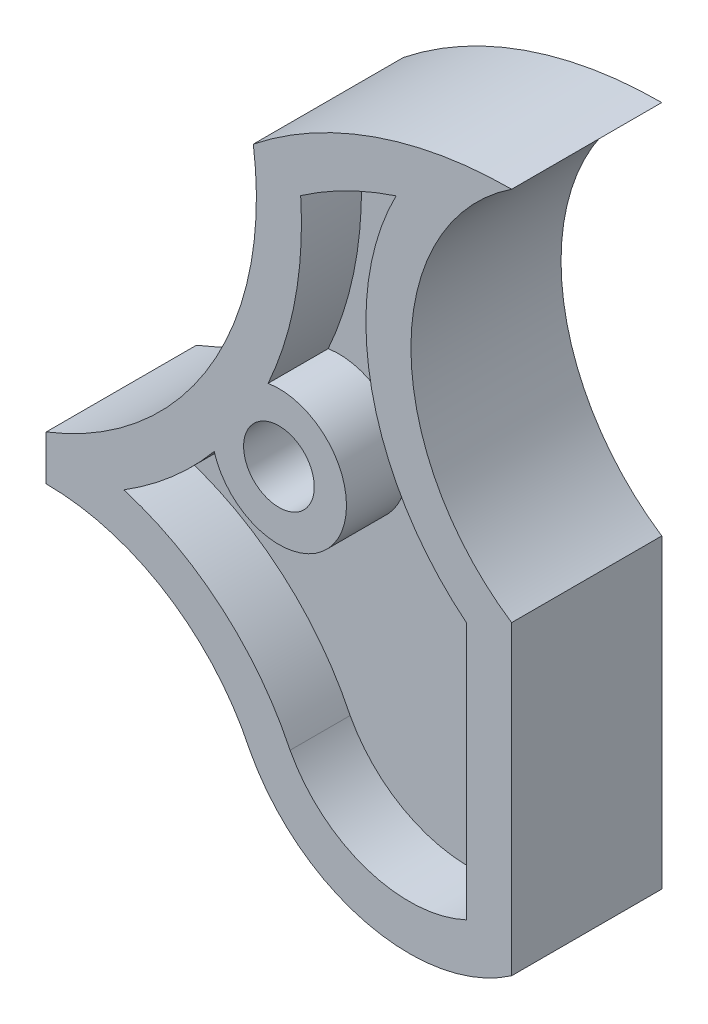
ISO-10303-21;
HEADER;
FILE_DESCRIPTION(('STEP AP214'),'2;1');
FILE_NAME('part.step','',(''),(''),'','','');
FILE_SCHEMA(('AUTOMOTIVE_DESIGN { 1 0 10303 214 1 1 1 1 }'));
ENDSEC;
DATA;
#1=APPLICATION_CONTEXT('core data for automotive mechanical design processes');
#2=APPLICATION_PROTOCOL_DEFINITION('international standard','automotive_design',2000,#1);
#3=PRODUCT_CONTEXT('',#1,'mechanical');
#4=PRODUCT('Part','Part','',(#3));
#5=PRODUCT_RELATED_PRODUCT_CATEGORY('part','',(#4));
#6=PRODUCT_DEFINITION_FORMATION('','',#4);
#7=PRODUCT_DEFINITION_CONTEXT('part definition',#1,'design');
#8=PRODUCT_DEFINITION('design','',#6,#7);
#9=PRODUCT_DEFINITION_SHAPE('','',#8);
#10=(LENGTH_UNIT() NAMED_UNIT(*) SI_UNIT(.MILLI.,.METRE.));
#11=(NAMED_UNIT(*) PLANE_ANGLE_UNIT() SI_UNIT($,.RADIAN.));
#12=(NAMED_UNIT(*) SI_UNIT($,.STERADIAN.) SOLID_ANGLE_UNIT());
#13=UNCERTAINTY_MEASURE_WITH_UNIT(LENGTH_MEASURE(1.E-05),#10,'distance_accuracy_value','');
#14=(GEOMETRIC_REPRESENTATION_CONTEXT(3) GLOBAL_UNCERTAINTY_ASSIGNED_CONTEXT((#13)) GLOBAL_UNIT_ASSIGNED_CONTEXT((#10,
#11,#12)) REPRESENTATION_CONTEXT('',''));
#15=CARTESIAN_POINT('',(0.,0.,0.));
#16=DIRECTION('',(0.,0.,1.));
#17=DIRECTION('',(1.,0.,0.));
#18=AXIS2_PLACEMENT_3D('',#15,#16,#17);
#19=CARTESIAN_POINT('',(-23.5,14.7439015319192,1.));
#20=DIRECTION('',(0.,0.,1.));
#21=DIRECTION('',(1.,0.,0.));
#22=AXIS2_PLACEMENT_3D('',#19,#20,#21);
#23=CYLINDRICAL_SURFACE('',#22,25.);
#24=CARTESIAN_POINT('',(-23.5,14.7439015319192,5.));
#25=DIRECTION('',(0.,0.,1.));
#26=DIRECTION('',(1.,0.,0.));
#27=AXIS2_PLACEMENT_3D('',#24,#25,#26);
#28=CIRCLE('',#27,25.);
#29=CARTESIAN_POINT('',(-0.721350865765483,4.44180739434517,5.));
#30=VERTEX_POINT('',#29);
#31=CARTESIAN_POINT('',(1.44789759534874,16.357098845329,5.));
#32=VERTEX_POINT('',#31);
#33=EDGE_CURVE('E352',#30,#32,#28,.T.);
#34=ORIENTED_EDGE('',*,*,#33,.F.);
#35=DIRECTION('',(0.,0.,-1.));
#36=VECTOR('',#35,1.);
#37=CARTESIAN_POINT('',(-0.721350865765483,4.44180739434517,17.596515457454));
#38=LINE('',#37,#36);
#39=CARTESIAN_POINT('',(-0.721350865765483,4.44180739434517,1.));
#40=VERTEX_POINT('',#39);
#41=EDGE_CURVE('E243',#30,#40,#38,.T.);
#42=ORIENTED_EDGE('',*,*,#41,.T.);
#43=CARTESIAN_POINT('',(-23.5,14.7439015319192,1.));
#44=DIRECTION('',(0.,0.,1.));
#45=DIRECTION('',(1.,0.,0.));
#46=AXIS2_PLACEMENT_3D('',#43,#44,#45);
#47=CIRCLE('',#46,25.);
#48=CARTESIAN_POINT('',(1.44789759534874,16.357098845329,1.));
#49=VERTEX_POINT('',#48);
#50=EDGE_CURVE('E323',#40,#49,#47,.T.);
#51=ORIENTED_EDGE('',*,*,#50,.T.);
#52=DIRECTION('',(0.,0.,1.));
#53=VECTOR('',#52,1.);
#54=CARTESIAN_POINT('',(1.44789759534874,16.357098845329,1.));
#55=LINE('',#54,#53);
#56=EDGE_CURVE('E361',#49,#32,#55,.T.);
#57=ORIENTED_EDGE('',*,*,#56,.T.);
#58=EDGE_LOOP('',(#34,#42,#51,#57));
#59=FACE_BOUND('',#58,.T.);
#60=ADVANCED_FACE('F78',(#59),#23,.T.);
#61=CARTESIAN_POINT('',(-10.3328475976985,-6.50759482985654,1.));
#62=VERTEX_POINT('',#61);
#63=CARTESIAN_POINT('',(-4.31318340157956,-1.28314026682141,1.));
#64=VERTEX_POINT('',#63);
#65=EDGE_CURVE('E324',#62,#64,#47,.T.);
#66=ORIENTED_EDGE('',*,*,#65,.T.);
#67=DIRECTION('',(0.,0.,-1.));
#68=VECTOR('',#67,1.);
#69=CARTESIAN_POINT('',(-4.31318340157956,-1.2831402668214,17.596515457454));
#70=LINE('',#69,#68);
#71=CARTESIAN_POINT('',(-4.31318340157956,-1.2831402668214,5.));
#72=VERTEX_POINT('',#71);
#73=EDGE_CURVE('E95',#72,#64,#70,.T.);
#74=ORIENTED_EDGE('',*,*,#73,.F.);
#75=CARTESIAN_POINT('',(-10.3328475976985,-6.50759482985654,5.));
#76=VERTEX_POINT('',#75);
#77=EDGE_CURVE('E308',#76,#72,#28,.T.);
#78=ORIENTED_EDGE('',*,*,#77,.F.);
#79=DIRECTION('',(0.,0.,1.));
#80=VECTOR('',#79,1.);
#81=CARTESIAN_POINT('',(-10.3328475976985,-6.50759482985654,1.));
#82=LINE('',#81,#80);
#83=EDGE_CURVE('E356',#62,#76,#82,.T.);
#84=ORIENTED_EDGE('',*,*,#83,.F.);
#85=EDGE_LOOP('',(#66,#74,#78,#84));
#86=FACE_BOUND('',#85,.T.);
#87=ADVANCED_FACE('F550',(#86),#23,.T.);
#88=CARTESIAN_POINT('',(0.,0.,1.));
#89=DIRECTION('',(0.,0.,1.));
#90=DIRECTION('',(1.,0.,0.));
#91=AXIS2_PLACEMENT_3D('',#88,#89,#90);
#92=PLANE('',#91);
#93=ORIENTED_EDGE('',*,*,#50,.F.);
#94=CARTESIAN_POINT('',(0.,0.,1.));
#95=DIRECTION('',(0.,0.,1.));
#96=DIRECTION('',(1.,0.,0.));
#97=AXIS2_PLACEMENT_3D('',#94,#95,#96);
#98=CIRCLE('',#97,4.5);
#99=EDGE_CURVE('E491',#40,#64,#98,.F.);
#100=ORIENTED_EDGE('',*,*,#99,.T.);
#101=ORIENTED_EDGE('',*,*,#65,.F.);
#102=CARTESIAN_POINT('',(-15.5,-23.75,1.));
#103=DIRECTION('',(0.,0.,1.));
#104=DIRECTION('',(1.,0.,0.));
#105=AXIS2_PLACEMENT_3D('',#102,#103,#104);
#106=CIRCLE('',#105,18.);
#107=CARTESIAN_POINT('',(0.741753076949209,-15.9907824500526,1.));
#108=VERTEX_POINT('',#107);
#109=EDGE_CURVE('E303',#108,#62,#106,.T.);
#110=ORIENTED_EDGE('',*,*,#109,.F.);
#111=CARTESIAN_POINT('',(8.68,-11.75,1.));
#112=DIRECTION('',(0.,0.,1.));
#113=DIRECTION('',(1.,0.,0.));
#114=AXIS2_PLACEMENT_3D('',#111,#112,#113);
#115=CIRCLE('',#114,9.);
#116=CARTESIAN_POINT('',(12.5,-19.8990858383011,1.));
#117=VERTEX_POINT('',#116);
#118=EDGE_CURVE('E307',#108,#117,#115,.T.);
#119=ORIENTED_EDGE('',*,*,#118,.T.);
#120=DIRECTION('',(0.,1.,0.));
#121=VECTOR('',#120,1.);
#122=CARTESIAN_POINT('',(12.5,0.,1.));
#123=LINE('',#122,#121);
#124=CARTESIAN_POINT('',(12.5,-2.76786817403663,1.));
#125=VERTEX_POINT('',#124);
#126=EDGE_CURVE('E312',#117,#125,#123,.T.);
#127=ORIENTED_EDGE('',*,*,#126,.T.);
#128=CARTESIAN_POINT('',(23.7915619758885,11.25,1.));
#129=DIRECTION('',(0.,0.,1.));
#130=DIRECTION('',(1.,0.,0.));
#131=AXIS2_PLACEMENT_3D('',#128,#129,#130);
#132=CIRCLE('',#131,18.);
#133=CARTESIAN_POINT('',(7.80315713489886,19.5186704276213,1.));
#134=VERTEX_POINT('',#133);
#135=EDGE_CURVE('E316',#134,#125,#132,.T.);
#136=ORIENTED_EDGE('',*,*,#135,.F.);
#137=CARTESIAN_POINT('',(15.5,-3.92152741588936,1.));
#138=DIRECTION('',(0.,0.,1.));
#139=DIRECTION('',(1.,0.,0.));
#140=AXIS2_PLACEMENT_3D('',#137,#138,#139);
#141=CIRCLE('',#140,24.6715274158894);
#142=EDGE_CURVE('E319',#134,#49,#141,.T.);
#143=ORIENTED_EDGE('',*,*,#142,.T.);
#144=EDGE_LOOP('',(#93,#100,#101,#110,#119,#127,#136,#143));
#145=FACE_BOUND('',#144,.T.);
#146=ADVANCED_FACE('F556',(#145),#92,.T.);
#147=CARTESIAN_POINT('',(-23.5,14.7439015319192,-1.));
#148=DIRECTION('',(0.,0.,-1.));
#149=DIRECTION('',(-1.,0.,0.));
#150=AXIS2_PLACEMENT_3D('',#147,#148,#149);
#151=CYLINDRICAL_SURFACE('',#150,25.);
#152=CARTESIAN_POINT('',(-4.31318340157956,-1.2831402668214,-1.));
#153=VERTEX_POINT('',#152);
#154=CARTESIAN_POINT('',(-4.31318340157957,-1.2831402668214,-5.));
#155=VERTEX_POINT('',#154);
#156=EDGE_CURVE('E233',#153,#155,#70,.T.);
#157=ORIENTED_EDGE('',*,*,#156,.F.);
#158=CARTESIAN_POINT('',(-23.5,14.7439015319192,-1.));
#159=DIRECTION('',(0.,0.,1.));
#160=DIRECTION('',(1.,0.,0.));
#161=AXIS2_PLACEMENT_3D('',#158,#159,#160);
#162=CIRCLE('',#161,25.);
#163=CARTESIAN_POINT('',(-10.3328475976985,-6.50759482985654,-1.));
#164=VERTEX_POINT('',#163);
#165=EDGE_CURVE('E484',#164,#153,#162,.T.);
#166=ORIENTED_EDGE('',*,*,#165,.F.);
#167=DIRECTION('',(0.,0.,-1.));
#168=VECTOR('',#167,1.);
#169=CARTESIAN_POINT('',(-10.3328475976985,-6.50759482985654,-1.));
#170=LINE('',#169,#168);
#171=CARTESIAN_POINT('',(-10.3328475976985,-6.50759482985654,-5.));
#172=VERTEX_POINT('',#171);
#173=EDGE_CURVE('E259',#164,#172,#170,.T.);
#174=ORIENTED_EDGE('',*,*,#173,.T.);
#175=CARTESIAN_POINT('',(-23.5,14.7439015319192,-5.));
#176=DIRECTION('',(0.,0.,1.));
#177=DIRECTION('',(1.,0.,0.));
#178=AXIS2_PLACEMENT_3D('',#175,#176,#177);
#179=CIRCLE('',#178,25.);
#180=EDGE_CURVE('E251',#172,#155,#179,.T.);
#181=ORIENTED_EDGE('',*,*,#180,.T.);
#182=EDGE_LOOP('',(#157,#166,#174,#181));
#183=FACE_BOUND('',#182,.T.);
#184=ADVANCED_FACE('F258',(#183),#151,.T.);
#185=CARTESIAN_POINT('',(-0.721350865765479,4.44180739434516,-1.));
#186=VERTEX_POINT('',#185);
#187=CARTESIAN_POINT('',(-0.721350865765483,4.44180739434517,-5.));
#188=VERTEX_POINT('',#187);
#189=EDGE_CURVE('E103',#186,#188,#38,.T.);
#190=ORIENTED_EDGE('',*,*,#189,.T.);
#191=CARTESIAN_POINT('',(1.44789759534874,16.357098845329,-5.));
#192=VERTEX_POINT('',#191);
#193=EDGE_CURVE('E253',#188,#192,#179,.T.);
#194=ORIENTED_EDGE('',*,*,#193,.T.);
#195=DIRECTION('',(0.,0.,-1.));
#196=VECTOR('',#195,1.);
#197=CARTESIAN_POINT('',(1.44789759534874,16.357098845329,-1.));
#198=LINE('',#197,#196);
#199=CARTESIAN_POINT('',(1.44789759534874,16.357098845329,-1.));
#200=VERTEX_POINT('',#199);
#201=EDGE_CURVE('E296',#200,#192,#198,.T.);
#202=ORIENTED_EDGE('',*,*,#201,.F.);
#203=EDGE_CURVE('E487',#186,#200,#162,.T.);
#204=ORIENTED_EDGE('',*,*,#203,.F.);
#205=EDGE_LOOP('',(#190,#194,#202,#204));
#206=FACE_BOUND('',#205,.T.);
#207=ADVANCED_FACE('F511',(#206),#151,.T.);
#208=CARTESIAN_POINT('',(0.,0.,-1.));
#209=DIRECTION('',(0.,0.,-1.));
#210=DIRECTION('',(1.,0.,0.));
#211=AXIS2_PLACEMENT_3D('',#208,#209,#210);
#212=PLANE('',#211);
#213=ORIENTED_EDGE('',*,*,#165,.T.);
#214=CARTESIAN_POINT('',(0.,0.,-1.));
#215=DIRECTION('',(0.,0.,-1.));
#216=DIRECTION('',(-1.,0.,0.));
#217=AXIS2_PLACEMENT_3D('',#214,#215,#216);
#218=CIRCLE('',#217,4.5);
#219=EDGE_CURVE('E237',#153,#186,#218,.F.);
#220=ORIENTED_EDGE('',*,*,#219,.T.);
#221=ORIENTED_EDGE('',*,*,#203,.T.);
#222=CARTESIAN_POINT('',(15.5,-3.92152741588936,-1.));
#223=DIRECTION('',(0.,0.,1.));
#224=DIRECTION('',(1.,0.,0.));
#225=AXIS2_PLACEMENT_3D('',#222,#223,#224);
#226=CIRCLE('',#225,24.6715274158894);
#227=CARTESIAN_POINT('',(7.80315713489886,19.5186704276213,-1.));
#228=VERTEX_POINT('',#227);
#229=EDGE_CURVE('E480',#228,#200,#226,.T.);
#230=ORIENTED_EDGE('',*,*,#229,.F.);
#231=CARTESIAN_POINT('',(23.7915619758885,11.25,-1.));
#232=DIRECTION('',(0.,0.,1.));
#233=DIRECTION('',(1.,0.,0.));
#234=AXIS2_PLACEMENT_3D('',#231,#232,#233);
#235=CIRCLE('',#234,18.);
#236=CARTESIAN_POINT('',(12.5,-2.76786817403663,-1.));
#237=VERTEX_POINT('',#236);
#238=EDGE_CURVE('E476',#228,#237,#235,.T.);
#239=ORIENTED_EDGE('',*,*,#238,.T.);
#240=DIRECTION('',(0.,1.,0.));
#241=VECTOR('',#240,1.);
#242=CARTESIAN_POINT('',(12.5,0.,-1.));
#243=LINE('',#242,#241);
#244=CARTESIAN_POINT('',(12.5,-19.8990858383011,-1.));
#245=VERTEX_POINT('',#244);
#246=EDGE_CURVE('E471',#245,#237,#243,.T.);
#247=ORIENTED_EDGE('',*,*,#246,.F.);
#248=CARTESIAN_POINT('',(8.68,-11.75,-1.));
#249=DIRECTION('',(0.,0.,1.));
#250=DIRECTION('',(1.,0.,0.));
#251=AXIS2_PLACEMENT_3D('',#248,#249,#250);
#252=CIRCLE('',#251,9.);
#253=CARTESIAN_POINT('',(0.741753076949209,-15.9907824500526,-1.));
#254=VERTEX_POINT('',#253);
#255=EDGE_CURVE('E469',#254,#245,#252,.T.);
#256=ORIENTED_EDGE('',*,*,#255,.F.);
#257=CARTESIAN_POINT('',(-15.5,-23.75,-1.));
#258=DIRECTION('',(0.,0.,1.));
#259=DIRECTION('',(1.,0.,0.));
#260=AXIS2_PLACEMENT_3D('',#257,#258,#259);
#261=CIRCLE('',#260,18.);
#262=EDGE_CURVE('E282',#254,#164,#261,.T.);
#263=ORIENTED_EDGE('',*,*,#262,.T.);
#264=EDGE_LOOP('',(#213,#220,#221,#230,#239,#247,#256,#263));
#265=FACE_BOUND('',#264,.T.);
#266=ADVANCED_FACE('F464',(#265),#212,.T.);
#267=CARTESIAN_POINT('',(0.,0.,5.));
#268=DIRECTION('',(0.,0.,-1.));
#269=DIRECTION('',(-1.,0.,0.));
#270=AXIS2_PLACEMENT_3D('',#267,#268,#269);
#271=PLANE('',#270);
#272=CARTESIAN_POINT('',(8.68,-11.75,5.));
#273=DIRECTION('',(0.,0.,1.));
#274=DIRECTION('',(1.,0.,0.));
#275=AXIS2_PLACEMENT_3D('',#272,#273,#274);
#276=CIRCLE('',#275,12.);
#277=CARTESIAN_POINT('',(-1.93963034816797,-17.3377948484415,5.));
#278=VERTEX_POINT('',#277);
#279=CARTESIAN_POINT('',(15.5,-21.6235809106929,5.));
#280=VERTEX_POINT('',#279);
#281=EDGE_CURVE('E411',#278,#280,#276,.T.);
#282=ORIENTED_EDGE('',*,*,#281,.T.);
#283=DIRECTION('',(0.,1.,0.));
#284=VECTOR('',#283,1.);
#285=CARTESIAN_POINT('',(15.5,-23.75,5.));
#286=LINE('',#285,#284);
#287=CARTESIAN_POINT('',(15.5,-1.25,5.));
#288=VERTEX_POINT('',#287);
#289=EDGE_CURVE('E435',#280,#288,#286,.T.);
#290=ORIENTED_EDGE('',*,*,#289,.T.);
#291=CARTESIAN_POINT('',(23.7915619758885,11.25,5.));
#292=DIRECTION('',(0.,0.,1.));
#293=DIRECTION('',(1.,0.,0.));
#294=AXIS2_PLACEMENT_3D('',#291,#292,#293);
#295=CIRCLE('',#294,15.);
#296=CARTESIAN_POINT('',(15.5,23.75,5.));
#297=VERTEX_POINT('',#296);
#298=EDGE_CURVE('E381',#297,#288,#295,.T.);
#299=ORIENTED_EDGE('',*,*,#298,.F.);
#300=CARTESIAN_POINT('',(15.5,-3.92152741588936,5.));
#301=DIRECTION('',(0.,0.,1.));
#302=DIRECTION('',(1.,0.,0.));
#303=AXIS2_PLACEMENT_3D('',#300,#301,#302);
#304=CIRCLE('',#303,27.6715274158894);
#305=CARTESIAN_POINT('',(-1.70634560244192,17.75,5.));
#306=VERTEX_POINT('',#305);
#307=EDGE_CURVE('E388',#306,#297,#304,.F.);
#308=ORIENTED_EDGE('',*,*,#307,.F.);
#309=CARTESIAN_POINT('',(-23.5,14.7439015319192,5.));
#310=DIRECTION('',(0.,0.,1.));
#311=DIRECTION('',(1.,0.,0.));
#312=AXIS2_PLACEMENT_3D('',#309,#310,#311);
#313=CIRCLE('',#312,22.);
#314=CARTESIAN_POINT('',(-15.5,-5.75000000000001,5.));
#315=VERTEX_POINT('',#314);
#316=EDGE_CURVE('E360',#315,#306,#313,.T.);
#317=ORIENTED_EDGE('',*,*,#316,.F.);
#318=DIRECTION('',(0.,-1.,0.));
#319=VECTOR('',#318,1.);
#320=CARTESIAN_POINT('',(-15.5,-23.75,5.));
#321=LINE('',#320,#319);
#322=CARTESIAN_POINT('',(-15.5,-8.75,5.));
#323=VERTEX_POINT('',#322);
#324=EDGE_CURVE('E438',#315,#323,#321,.T.);
#325=ORIENTED_EDGE('',*,*,#324,.T.);
#326=CARTESIAN_POINT('',(-15.5,-23.75,5.));
#327=DIRECTION('',(0.,0.,1.));
#328=DIRECTION('',(1.,0.,0.));
#329=AXIS2_PLACEMENT_3D('',#326,#327,#328);
#330=CIRCLE('',#329,15.);
#331=EDGE_CURVE('E406',#278,#323,#330,.T.);
#332=ORIENTED_EDGE('',*,*,#331,.F.);
#333=EDGE_LOOP('',(#282,#290,#299,#308,#317,#325,#332));
#334=FACE_BOUND('',#333,.T.);
#335=CARTESIAN_POINT('',(-15.5,-23.75,5.));
#336=DIRECTION('',(0.,0.,1.));
#337=DIRECTION('',(1.,0.,0.));
#338=AXIS2_PLACEMENT_3D('',#335,#336,#337);
#339=CIRCLE('',#338,18.);
#340=CARTESIAN_POINT('',(0.741753076949209,-15.9907824500526,5.));
#341=VERTEX_POINT('',#340);
#342=EDGE_CURVE('E286',#341,#76,#339,.T.);
#343=ORIENTED_EDGE('',*,*,#342,.T.);
#344=ORIENTED_EDGE('',*,*,#77,.T.);
#345=CARTESIAN_POINT('',(0.,0.,5.));
#346=DIRECTION('',(0.,0.,-1.));
#347=DIRECTION('',(-1.,0.,0.));
#348=AXIS2_PLACEMENT_3D('',#345,#346,#347);
#349=CIRCLE('',#348,4.5);
#350=EDGE_CURVE('E495',#30,#72,#349,.T.);
#351=ORIENTED_EDGE('',*,*,#350,.F.);
#352=ORIENTED_EDGE('',*,*,#33,.T.);
#353=CARTESIAN_POINT('',(15.5,-3.92152741588936,5.));
#354=DIRECTION('',(0.,0.,1.));
#355=DIRECTION('',(1.,0.,0.));
#356=AXIS2_PLACEMENT_3D('',#353,#354,#355);
#357=CIRCLE('',#356,24.6715274158894);
#358=CARTESIAN_POINT('',(7.80315713489886,19.5186704276213,5.));
#359=VERTEX_POINT('',#358);
#360=EDGE_CURVE('E348',#359,#32,#357,.T.);
#361=ORIENTED_EDGE('',*,*,#360,.F.);
#362=CARTESIAN_POINT('',(23.7915619758885,11.25,5.));
#363=DIRECTION('',(0.,0.,1.));
#364=DIRECTION('',(1.,0.,0.));
#365=AXIS2_PLACEMENT_3D('',#362,#363,#364);
#366=CIRCLE('',#365,18.);
#367=CARTESIAN_POINT('',(12.5,-2.76786817403663,5.));
#368=VERTEX_POINT('',#367);
#369=EDGE_CURVE('E344',#359,#368,#366,.T.);
#370=ORIENTED_EDGE('',*,*,#369,.T.);
#371=DIRECTION('',(0.,1.,0.));
#372=VECTOR('',#371,1.);
#373=CARTESIAN_POINT('',(12.5,0.,5.));
#374=LINE('',#373,#372);
#375=CARTESIAN_POINT('',(12.5,-19.8990858383011,5.));
#376=VERTEX_POINT('',#375);
#377=EDGE_CURVE('E340',#376,#368,#374,.T.);
#378=ORIENTED_EDGE('',*,*,#377,.F.);
#379=CARTESIAN_POINT('',(8.68,-11.75,5.));
#380=DIRECTION('',(0.,0.,1.));
#381=DIRECTION('',(1.,0.,0.));
#382=AXIS2_PLACEMENT_3D('',#379,#380,#381);
#383=CIRCLE('',#382,9.);
#384=EDGE_CURVE('E336',#341,#376,#383,.T.);
#385=ORIENTED_EDGE('',*,*,#384,.F.);
#386=EDGE_LOOP('',(#343,#344,#351,#352,#361,#370,#378,#385));
#387=FACE_BOUND('',#386,.T.);
#388=CARTESIAN_POINT('',(0.,0.,5.));
#389=DIRECTION('',(0.,0.,-1.));
#390=DIRECTION('',(-1.,0.,0.));
#391=AXIS2_PLACEMENT_3D('',#388,#389,#390);
#392=CIRCLE('',#391,2.355);
#393=CARTESIAN_POINT('',(-2.355,0.,5.));
#394=VERTEX_POINT('',#393);
#395=EDGE_CURVE('E494',#394,#394,#392,.T.);
#396=ORIENTED_EDGE('',*,*,#395,.T.);
#397=EDGE_LOOP('',(#396));
#398=FACE_BOUND('',#397,.T.);
#399=ADVANCED_FACE('F600',(#334,#387,#398),#271,.F.);
#400=CARTESIAN_POINT('',(0.,0.,-5.));
#401=DIRECTION('',(0.,0.,-1.));
#402=DIRECTION('',(-1.,0.,0.));
#403=AXIS2_PLACEMENT_3D('',#400,#401,#402);
#404=PLANE('',#403);
#405=CARTESIAN_POINT('',(-15.5,-23.75,-5.));
#406=DIRECTION('',(0.,0.,1.));
#407=DIRECTION('',(1.,0.,0.));
#408=AXIS2_PLACEMENT_3D('',#405,#406,#407);
#409=CIRCLE('',#408,18.);
#410=CARTESIAN_POINT('',(0.741753076949209,-15.9907824500526,-5.));
#411=VERTEX_POINT('',#410);
#412=EDGE_CURVE('E267',#411,#172,#409,.T.);
#413=ORIENTED_EDGE('',*,*,#412,.F.);
#414=CARTESIAN_POINT('',(8.68,-11.75,-5.));
#415=DIRECTION('',(0.,0.,1.));
#416=DIRECTION('',(1.,0.,0.));
#417=AXIS2_PLACEMENT_3D('',#414,#415,#416);
#418=CIRCLE('',#417,9.);
#419=CARTESIAN_POINT('',(12.5,-19.8990858383011,-5.));
#420=VERTEX_POINT('',#419);
#421=EDGE_CURVE('E278',#411,#420,#418,.T.);
#422=ORIENTED_EDGE('',*,*,#421,.T.);
#423=DIRECTION('',(0.,1.,0.));
#424=VECTOR('',#423,1.);
#425=CARTESIAN_POINT('',(12.5,0.,-5.));
#426=LINE('',#425,#424);
#427=CARTESIAN_POINT('',(12.5,-2.76786817403663,-5.));
#428=VERTEX_POINT('',#427);
#429=EDGE_CURVE('E274',#420,#428,#426,.T.);
#430=ORIENTED_EDGE('',*,*,#429,.T.);
#431=CARTESIAN_POINT('',(23.7915619758885,11.25,-5.));
#432=DIRECTION('',(0.,0.,1.));
#433=DIRECTION('',(1.,0.,0.));
#434=AXIS2_PLACEMENT_3D('',#431,#432,#433);
#435=CIRCLE('',#434,18.);
#436=CARTESIAN_POINT('',(7.80315713489886,19.5186704276213,-5.));
#437=VERTEX_POINT('',#436);
#438=EDGE_CURVE('E265',#437,#428,#435,.T.);
#439=ORIENTED_EDGE('',*,*,#438,.F.);
#440=CARTESIAN_POINT('',(15.5,-3.92152741588936,-5.));
#441=DIRECTION('',(0.,0.,1.));
#442=DIRECTION('',(1.,0.,0.));
#443=AXIS2_PLACEMENT_3D('',#440,#441,#442);
#444=CIRCLE('',#443,24.6715274158894);
#445=EDGE_CURVE('E261',#437,#192,#444,.T.);
#446=ORIENTED_EDGE('',*,*,#445,.T.);
#447=ORIENTED_EDGE('',*,*,#193,.F.);
#448=CARTESIAN_POINT('',(0.,0.,-5.));
#449=DIRECTION('',(0.,0.,-1.));
#450=DIRECTION('',(-1.,0.,0.));
#451=AXIS2_PLACEMENT_3D('',#448,#449,#450);
#452=CIRCLE('',#451,4.5);
#453=EDGE_CURVE('E236',#155,#188,#452,.F.);
#454=ORIENTED_EDGE('',*,*,#453,.F.);
#455=ORIENTED_EDGE('',*,*,#180,.F.);
#456=EDGE_LOOP('',(#413,#422,#430,#439,#446,#447,#454,#455));
#457=FACE_BOUND('',#456,.T.);
#458=DIRECTION('',(0.,1.,0.));
#459=VECTOR('',#458,1.);
#460=CARTESIAN_POINT('',(15.5,-23.75,-5.));
#461=LINE('',#460,#459);
#462=CARTESIAN_POINT('',(15.5,-21.6235809106929,-5.));
#463=VERTEX_POINT('',#462);
#464=CARTESIAN_POINT('',(15.5,-1.25,-5.));
#465=VERTEX_POINT('',#464);
#466=EDGE_CURVE('E422',#463,#465,#461,.T.);
#467=ORIENTED_EDGE('',*,*,#466,.F.);
#468=CARTESIAN_POINT('',(8.68,-11.75,-5.));
#469=DIRECTION('',(0.,0.,1.));
#470=DIRECTION('',(1.,0.,0.));
#471=AXIS2_PLACEMENT_3D('',#468,#469,#470);
#472=CIRCLE('',#471,12.);
#473=CARTESIAN_POINT('',(-1.93963034816797,-17.3377948484415,-5.));
#474=VERTEX_POINT('',#473);
#475=EDGE_CURVE('E402',#474,#463,#472,.T.);
#476=ORIENTED_EDGE('',*,*,#475,.F.);
#477=CARTESIAN_POINT('',(-15.5,-23.75,-5.));
#478=DIRECTION('',(0.,0.,1.));
#479=DIRECTION('',(1.,0.,0.));
#480=AXIS2_PLACEMENT_3D('',#477,#478,#479);
#481=CIRCLE('',#480,15.);
#482=CARTESIAN_POINT('',(-15.5,-8.75,-5.));
#483=VERTEX_POINT('',#482);
#484=EDGE_CURVE('E405',#474,#483,#481,.T.);
#485=ORIENTED_EDGE('',*,*,#484,.T.);
#486=DIRECTION('',(0.,-1.,0.));
#487=VECTOR('',#486,1.);
#488=CARTESIAN_POINT('',(-15.5,-23.75,-5.));
#489=LINE('',#488,#487);
#490=CARTESIAN_POINT('',(-15.5,-5.75000000000001,-5.));
#491=VERTEX_POINT('',#490);
#492=EDGE_CURVE('E439',#491,#483,#489,.T.);
#493=ORIENTED_EDGE('',*,*,#492,.F.);
#494=CARTESIAN_POINT('',(-23.5,14.7439015319192,-5.));
#495=DIRECTION('',(0.,0.,1.));
#496=DIRECTION('',(1.,0.,0.));
#497=AXIS2_PLACEMENT_3D('',#494,#495,#496);
#498=CIRCLE('',#497,22.);
#499=CARTESIAN_POINT('',(-1.70634560244192,17.75,-5.));
#500=VERTEX_POINT('',#499);
#501=EDGE_CURVE('E383',#491,#500,#498,.T.);
#502=ORIENTED_EDGE('',*,*,#501,.T.);
#503=CARTESIAN_POINT('',(15.5,-3.92152741588936,-5.));
#504=DIRECTION('',(0.,0.,1.));
#505=DIRECTION('',(1.,0.,0.));
#506=AXIS2_PLACEMENT_3D('',#503,#504,#505);
#507=CIRCLE('',#506,27.6715274158894);
#508=CARTESIAN_POINT('',(15.5,23.75,-5.));
#509=VERTEX_POINT('',#508);
#510=EDGE_CURVE('E387',#500,#509,#507,.F.);
#511=ORIENTED_EDGE('',*,*,#510,.T.);
#512=CARTESIAN_POINT('',(23.7915619758885,11.25,-5.));
#513=DIRECTION('',(0.,0.,1.));
#514=DIRECTION('',(1.,0.,0.));
#515=AXIS2_PLACEMENT_3D('',#512,#513,#514);
#516=CIRCLE('',#515,15.);
#517=EDGE_CURVE('E425',#509,#465,#516,.T.);
#518=ORIENTED_EDGE('',*,*,#517,.T.);
#519=EDGE_LOOP('',(#467,#476,#485,#493,#502,#511,#518));
#520=FACE_BOUND('',#519,.T.);
#521=CARTESIAN_POINT('',(0.,0.,-5.));
#522=DIRECTION('',(0.,0.,-1.));
#523=DIRECTION('',(-1.,0.,0.));
#524=AXIS2_PLACEMENT_3D('',#521,#522,#523);
#525=CIRCLE('',#524,2.355);
#526=CARTESIAN_POINT('',(-2.355,0.,-5.));
#527=VERTEX_POINT('',#526);
#528=EDGE_CURVE('E255',#527,#527,#525,.F.);
#529=ORIENTED_EDGE('',*,*,#528,.T.);
#530=EDGE_LOOP('',(#529));
#531=FACE_BOUND('',#530,.T.);
#532=ADVANCED_FACE('F249',(#457,#520,#531),#404,.T.);
#533=CARTESIAN_POINT('',(15.5,-23.75,5.));
#534=DIRECTION('',(-1.,0.,0.));
#535=DIRECTION('',(0.,0.,1.));
#536=AXIS2_PLACEMENT_3D('',#533,#534,#535);
#537=PLANE('',#536);
#538=DIRECTION('',(0.,0.,1.));
#539=VECTOR('',#538,1.);
#540=CARTESIAN_POINT('',(15.5,-21.6235809106929,-5.));
#541=LINE('',#540,#539);
#542=EDGE_CURVE('E377',#463,#280,#541,.T.);
#543=ORIENTED_EDGE('',*,*,#542,.F.);
#544=ORIENTED_EDGE('',*,*,#466,.T.);
#545=DIRECTION('',(0.,0.,1.));
#546=VECTOR('',#545,1.);
#547=CARTESIAN_POINT('',(15.5,-1.25,-5.));
#548=LINE('',#547,#546);
#549=EDGE_CURVE('E414',#465,#288,#548,.T.);
#550=ORIENTED_EDGE('',*,*,#549,.T.);
#551=ORIENTED_EDGE('',*,*,#289,.F.);
#552=EDGE_LOOP('',(#543,#544,#550,#551));
#553=FACE_BOUND('',#552,.T.);
#554=ADVANCED_FACE('F80',(#553),#537,.F.);
#555=CARTESIAN_POINT('',(-15.5,-23.75,5.));
#556=DIRECTION('',(1.,0.,0.));
#557=DIRECTION('',(0.,0.,-1.));
#558=AXIS2_PLACEMENT_3D('',#555,#556,#557);
#559=PLANE('',#558);
#560=ORIENTED_EDGE('',*,*,#324,.F.);
#561=DIRECTION('',(0.,0.,1.));
#562=VECTOR('',#561,1.);
#563=CARTESIAN_POINT('',(-15.5,-5.75000000000001,-5.));
#564=LINE('',#563,#562);
#565=EDGE_CURVE('E382',#491,#315,#564,.T.);
#566=ORIENTED_EDGE('',*,*,#565,.F.);
#567=ORIENTED_EDGE('',*,*,#492,.T.);
#568=DIRECTION('',(0.,0.,1.));
#569=VECTOR('',#568,1.);
#570=CARTESIAN_POINT('',(-15.5,-8.75,-5.));
#571=LINE('',#570,#569);
#572=EDGE_CURVE('E418',#483,#323,#571,.T.);
#573=ORIENTED_EDGE('',*,*,#572,.T.);
#574=EDGE_LOOP('',(#560,#566,#567,#573));
#575=FACE_BOUND('',#574,.T.);
#576=ADVANCED_FACE('F589',(#575),#559,.F.);
#577=CARTESIAN_POINT('',(-15.5,-23.75,-5.));
#578=DIRECTION('',(0.,0.,1.));
#579=DIRECTION('',(1.,0.,0.));
#580=AXIS2_PLACEMENT_3D('',#577,#578,#579);
#581=CYLINDRICAL_SURFACE('',#580,15.);
#582=ORIENTED_EDGE('',*,*,#331,.T.);
#583=ORIENTED_EDGE('',*,*,#572,.F.);
#584=ORIENTED_EDGE('',*,*,#484,.F.);
#585=DIRECTION('',(0.,0.,1.));
#586=VECTOR('',#585,1.);
#587=CARTESIAN_POINT('',(-1.93963034816797,-17.3377948484415,-5.));
#588=LINE('',#587,#586);
#589=EDGE_CURVE('E410',#474,#278,#588,.T.);
#590=ORIENTED_EDGE('',*,*,#589,.T.);
#591=EDGE_LOOP('',(#582,#583,#584,#590));
#592=FACE_BOUND('',#591,.T.);
#593=ADVANCED_FACE('F585',(#592),#581,.F.);
#594=CARTESIAN_POINT('',(8.68,-11.75,-5.));
#595=DIRECTION('',(0.,0.,1.));
#596=DIRECTION('',(1.,0.,0.));
#597=AXIS2_PLACEMENT_3D('',#594,#595,#596);
#598=CYLINDRICAL_SURFACE('',#597,12.);
#599=ORIENTED_EDGE('',*,*,#281,.F.);
#600=ORIENTED_EDGE('',*,*,#589,.F.);
#601=ORIENTED_EDGE('',*,*,#475,.T.);
#602=ORIENTED_EDGE('',*,*,#542,.T.);
#603=EDGE_LOOP('',(#599,#600,#601,#602));
#604=FACE_BOUND('',#603,.T.);
#605=ADVANCED_FACE('F588',(#604),#598,.T.);
#606=CARTESIAN_POINT('',(23.7915619758885,11.25,-5.));
#607=DIRECTION('',(0.,0.,1.));
#608=DIRECTION('',(1.,0.,0.));
#609=AXIS2_PLACEMENT_3D('',#606,#607,#608);
#610=CYLINDRICAL_SURFACE('',#609,15.);
#611=ORIENTED_EDGE('',*,*,#298,.T.);
#612=ORIENTED_EDGE('',*,*,#549,.F.);
#613=ORIENTED_EDGE('',*,*,#517,.F.);
#614=DIRECTION('',(0.,0.,-1.));
#615=VECTOR('',#614,1.);
#616=CARTESIAN_POINT('',(15.5,23.75,5.));
#617=LINE('',#616,#615);
#618=EDGE_CURVE('E442',#297,#509,#617,.T.);
#619=ORIENTED_EDGE('',*,*,#618,.F.);
#620=EDGE_LOOP('',(#611,#612,#613,#619));
#621=FACE_BOUND('',#620,.T.);
#622=ADVANCED_FACE('F583',(#621),#610,.F.);
#623=CARTESIAN_POINT('',(-23.5,14.7439015319192,-5.));
#624=DIRECTION('',(0.,0.,1.));
#625=DIRECTION('',(1.,0.,0.));
#626=AXIS2_PLACEMENT_3D('',#623,#624,#625);
#627=CYLINDRICAL_SURFACE('',#626,22.);
#628=ORIENTED_EDGE('',*,*,#316,.T.);
#629=DIRECTION('',(0.,0.,1.));
#630=VECTOR('',#629,1.);
#631=CARTESIAN_POINT('',(-1.70634560244192,17.75,-5.));
#632=LINE('',#631,#630);
#633=EDGE_CURVE('E392',#500,#306,#632,.T.);
#634=ORIENTED_EDGE('',*,*,#633,.F.);
#635=ORIENTED_EDGE('',*,*,#501,.F.);
#636=ORIENTED_EDGE('',*,*,#565,.T.);
#637=EDGE_LOOP('',(#628,#634,#635,#636));
#638=FACE_BOUND('',#637,.T.);
#639=ADVANCED_FACE('F579',(#638),#627,.F.);
#640=CARTESIAN_POINT('',(15.5,-3.92152741588936,-5.));
#641=DIRECTION('',(0.,0.,1.));
#642=DIRECTION('',(1.,0.,0.));
#643=AXIS2_PLACEMENT_3D('',#640,#641,#642);
#644=CYLINDRICAL_SURFACE('',#643,27.6715274158894);
#645=ORIENTED_EDGE('',*,*,#307,.T.);
#646=ORIENTED_EDGE('',*,*,#618,.T.);
#647=ORIENTED_EDGE('',*,*,#510,.F.);
#648=ORIENTED_EDGE('',*,*,#633,.T.);
#649=EDGE_LOOP('',(#645,#646,#647,#648));
#650=FACE_BOUND('',#649,.T.);
#651=ADVANCED_FACE('F575',(#650),#644,.T.);
#652=CARTESIAN_POINT('',(-15.5,-23.75,1.));
#653=DIRECTION('',(0.,0.,1.));
#654=DIRECTION('',(1.,0.,0.));
#655=AXIS2_PLACEMENT_3D('',#652,#653,#654);
#656=CYLINDRICAL_SURFACE('',#655,18.);
#657=ORIENTED_EDGE('',*,*,#342,.F.);
#658=DIRECTION('',(0.,0.,1.));
#659=VECTOR('',#658,1.);
#660=CARTESIAN_POINT('',(0.741753076949209,-15.9907824500526,1.));
#661=LINE('',#660,#659);
#662=EDGE_CURVE('E332',#108,#341,#661,.T.);
#663=ORIENTED_EDGE('',*,*,#662,.F.);
#664=ORIENTED_EDGE('',*,*,#109,.T.);
#665=ORIENTED_EDGE('',*,*,#83,.T.);
#666=EDGE_LOOP('',(#657,#663,#664,#665));
#667=FACE_BOUND('',#666,.T.);
#668=ADVANCED_FACE('F565',(#667),#656,.T.);
#669=CARTESIAN_POINT('',(15.5,-3.92152741588936,1.));
#670=DIRECTION('',(0.,0.,1.));
#671=DIRECTION('',(1.,0.,0.));
#672=AXIS2_PLACEMENT_3D('',#669,#670,#671);
#673=CYLINDRICAL_SURFACE('',#672,24.6715274158894);
#674=ORIENTED_EDGE('',*,*,#360,.T.);
#675=ORIENTED_EDGE('',*,*,#56,.F.);
#676=ORIENTED_EDGE('',*,*,#142,.F.);
#677=DIRECTION('',(0.,0.,1.));
#678=VECTOR('',#677,1.);
#679=CARTESIAN_POINT('',(7.80315713489886,19.5186704276213,1.));
#680=LINE('',#679,#678);
#681=EDGE_CURVE('E365',#134,#359,#680,.T.);
#682=ORIENTED_EDGE('',*,*,#681,.T.);
#683=EDGE_LOOP('',(#674,#675,#676,#682));
#684=FACE_BOUND('',#683,.T.);
#685=ADVANCED_FACE('F561',(#684),#673,.F.);
#686=CARTESIAN_POINT('',(23.7915619758885,11.25,1.));
#687=DIRECTION('',(0.,0.,1.));
#688=DIRECTION('',(1.,0.,0.));
#689=AXIS2_PLACEMENT_3D('',#686,#687,#688);
#690=CYLINDRICAL_SURFACE('',#689,18.);
#691=ORIENTED_EDGE('',*,*,#369,.F.);
#692=ORIENTED_EDGE('',*,*,#681,.F.);
#693=ORIENTED_EDGE('',*,*,#135,.T.);
#694=DIRECTION('',(0.,0.,1.));
#695=VECTOR('',#694,1.);
#696=CARTESIAN_POINT('',(12.5,-2.76786817403663,1.));
#697=LINE('',#696,#695);
#698=EDGE_CURVE('E368',#125,#368,#697,.T.);
#699=ORIENTED_EDGE('',*,*,#698,.T.);
#700=EDGE_LOOP('',(#691,#692,#693,#699));
#701=FACE_BOUND('',#700,.T.);
#702=ADVANCED_FACE('F564',(#701),#690,.T.);
#703=CARTESIAN_POINT('',(12.5,0.,1.));
#704=DIRECTION('',(1.,0.,0.));
#705=DIRECTION('',(0.,0.,-1.));
#706=AXIS2_PLACEMENT_3D('',#703,#704,#705);
#707=PLANE('',#706);
#708=ORIENTED_EDGE('',*,*,#377,.T.);
#709=ORIENTED_EDGE('',*,*,#698,.F.);
#710=ORIENTED_EDGE('',*,*,#126,.F.);
#711=DIRECTION('',(0.,0.,1.));
#712=VECTOR('',#711,1.);
#713=CARTESIAN_POINT('',(12.5,-19.8990858383011,1.));
#714=LINE('',#713,#712);
#715=EDGE_CURVE('E371',#117,#376,#714,.T.);
#716=ORIENTED_EDGE('',*,*,#715,.T.);
#717=EDGE_LOOP('',(#708,#709,#710,#716));
#718=FACE_BOUND('',#717,.T.);
#719=ADVANCED_FACE('F544',(#718),#707,.F.);
#720=CARTESIAN_POINT('',(8.68,-11.75,1.));
#721=DIRECTION('',(0.,0.,1.));
#722=DIRECTION('',(1.,0.,0.));
#723=AXIS2_PLACEMENT_3D('',#720,#721,#722);
#724=CYLINDRICAL_SURFACE('',#723,9.);
#725=ORIENTED_EDGE('',*,*,#384,.T.);
#726=ORIENTED_EDGE('',*,*,#715,.F.);
#727=ORIENTED_EDGE('',*,*,#118,.F.);
#728=ORIENTED_EDGE('',*,*,#662,.T.);
#729=EDGE_LOOP('',(#725,#726,#727,#728));
#730=FACE_BOUND('',#729,.T.);
#731=ADVANCED_FACE('F537',(#730),#724,.F.);
#732=CARTESIAN_POINT('',(-15.5,-23.75,-1.));
#733=DIRECTION('',(0.,0.,-1.));
#734=DIRECTION('',(-1.,0.,0.));
#735=AXIS2_PLACEMENT_3D('',#732,#733,#734);
#736=CYLINDRICAL_SURFACE('',#735,18.);
#737=ORIENTED_EDGE('',*,*,#412,.T.);
#738=ORIENTED_EDGE('',*,*,#173,.F.);
#739=ORIENTED_EDGE('',*,*,#262,.F.);
#740=DIRECTION('',(0.,0.,-1.));
#741=VECTOR('',#740,1.);
#742=CARTESIAN_POINT('',(0.741753076949209,-15.9907824500526,-1.));
#743=LINE('',#742,#741);
#744=EDGE_CURVE('E283',#254,#411,#743,.T.);
#745=ORIENTED_EDGE('',*,*,#744,.T.);
#746=EDGE_LOOP('',(#737,#738,#739,#745));
#747=FACE_BOUND('',#746,.T.);
#748=ADVANCED_FACE('F534',(#747),#736,.T.);
#749=CARTESIAN_POINT('',(8.68,-11.75,-1.));
#750=DIRECTION('',(0.,0.,-1.));
#751=DIRECTION('',(-1.,0.,0.));
#752=AXIS2_PLACEMENT_3D('',#749,#750,#751);
#753=CYLINDRICAL_SURFACE('',#752,9.);
#754=ORIENTED_EDGE('',*,*,#421,.F.);
#755=ORIENTED_EDGE('',*,*,#744,.F.);
#756=ORIENTED_EDGE('',*,*,#255,.T.);
#757=DIRECTION('',(0.,0.,-1.));
#758=VECTOR('',#757,1.);
#759=CARTESIAN_POINT('',(12.5,-19.8990858383011,-1.));
#760=LINE('',#759,#758);
#761=EDGE_CURVE('E287',#245,#420,#760,.T.);
#762=ORIENTED_EDGE('',*,*,#761,.T.);
#763=EDGE_LOOP('',(#754,#755,#756,#762));
#764=FACE_BOUND('',#763,.T.);
#765=ADVANCED_FACE('F532',(#764),#753,.F.);
#766=CARTESIAN_POINT('',(12.5,0.,-1.));
#767=DIRECTION('',(-1.,0.,0.));
#768=DIRECTION('',(0.,0.,1.));
#769=AXIS2_PLACEMENT_3D('',#766,#767,#768);
#770=PLANE('',#769);
#771=ORIENTED_EDGE('',*,*,#429,.F.);
#772=ORIENTED_EDGE('',*,*,#761,.F.);
#773=ORIENTED_EDGE('',*,*,#246,.T.);
#774=DIRECTION('',(0.,0.,-1.));
#775=VECTOR('',#774,1.);
#776=CARTESIAN_POINT('',(12.5,-2.76786817403663,-1.));
#777=LINE('',#776,#775);
#778=EDGE_CURVE('E290',#237,#428,#777,.T.);
#779=ORIENTED_EDGE('',*,*,#778,.T.);
#780=EDGE_LOOP('',(#771,#772,#773,#779));
#781=FACE_BOUND('',#780,.T.);
#782=ADVANCED_FACE('F529',(#781),#770,.T.);
#783=CARTESIAN_POINT('',(23.7915619758885,11.25,-1.));
#784=DIRECTION('',(0.,0.,-1.));
#785=DIRECTION('',(-1.,0.,0.));
#786=AXIS2_PLACEMENT_3D('',#783,#784,#785);
#787=CYLINDRICAL_SURFACE('',#786,18.);
#788=ORIENTED_EDGE('',*,*,#438,.T.);
#789=ORIENTED_EDGE('',*,*,#778,.F.);
#790=ORIENTED_EDGE('',*,*,#238,.F.);
#791=DIRECTION('',(0.,0.,-1.));
#792=VECTOR('',#791,1.);
#793=CARTESIAN_POINT('',(7.80315713489886,19.5186704276213,-1.));
#794=LINE('',#793,#792);
#795=EDGE_CURVE('E293',#228,#437,#794,.T.);
#796=ORIENTED_EDGE('',*,*,#795,.T.);
#797=EDGE_LOOP('',(#788,#789,#790,#796));
#798=FACE_BOUND('',#797,.T.);
#799=ADVANCED_FACE('F521',(#798),#787,.T.);
#800=CARTESIAN_POINT('',(15.5,-3.92152741588936,-1.));
#801=DIRECTION('',(0.,0.,-1.));
#802=DIRECTION('',(-1.,0.,0.));
#803=AXIS2_PLACEMENT_3D('',#800,#801,#802);
#804=CYLINDRICAL_SURFACE('',#803,24.6715274158894);
#805=ORIENTED_EDGE('',*,*,#445,.F.);
#806=ORIENTED_EDGE('',*,*,#795,.F.);
#807=ORIENTED_EDGE('',*,*,#229,.T.);
#808=ORIENTED_EDGE('',*,*,#201,.T.);
#809=EDGE_LOOP('',(#805,#806,#807,#808));
#810=FACE_BOUND('',#809,.T.);
#811=ADVANCED_FACE('F518',(#810),#804,.F.);
#812=CARTESIAN_POINT('',(0.,0.,17.596515457454));
#813=DIRECTION('',(0.,0.,-1.));
#814=DIRECTION('',(-1.,0.,0.));
#815=AXIS2_PLACEMENT_3D('',#812,#813,#814);
#816=CYLINDRICAL_SURFACE('',#815,2.355);
#817=CARTESIAN_POINT('',(0.,0.,-1.));
#818=DIRECTION('',(0.,0.,-1.));
#819=DIRECTION('',(-1.,0.,0.));
#820=AXIS2_PLACEMENT_3D('',#817,#818,#819);
#821=CIRCLE('',#820,2.355);
#822=CARTESIAN_POINT('',(-2.355,0.,-1.));
#823=VERTEX_POINT('',#822);
#824=EDGE_CURVE('E82',#823,#823,#821,.F.);
#825=ORIENTED_EDGE('',*,*,#824,.T.);
#826=EDGE_LOOP('',(#825));
#827=FACE_BOUND('',#826,.T.);
#828=ORIENTED_EDGE('',*,*,#528,.F.);
#829=EDGE_LOOP('',(#828));
#830=FACE_BOUND('',#829,.T.);
#831=ADVANCED_FACE('F455',(#827,#830),#816,.F.);
#832=CARTESIAN_POINT('',(0.,0.,17.596515457454));
#833=DIRECTION('',(0.,0.,-1.));
#834=DIRECTION('',(-1.,0.,0.));
#835=AXIS2_PLACEMENT_3D('',#832,#833,#834);
#836=CYLINDRICAL_SURFACE('',#835,4.5);
#837=ORIENTED_EDGE('',*,*,#219,.F.);
#838=ORIENTED_EDGE('',*,*,#156,.T.);
#839=ORIENTED_EDGE('',*,*,#453,.T.);
#840=ORIENTED_EDGE('',*,*,#189,.F.);
#841=EDGE_LOOP('',(#837,#838,#839,#840));
#842=FACE_BOUND('',#841,.T.);
#843=ADVANCED_FACE('F235',(#842),#836,.T.);
#844=CARTESIAN_POINT('',(0.,0.,1.));
#845=DIRECTION('',(0.,0.,1.));
#846=DIRECTION('',(1.,0.,0.));
#847=AXIS2_PLACEMENT_3D('',#844,#845,#846);
#848=CIRCLE('',#847,2.355);
#849=CARTESIAN_POINT('',(2.355,0.,1.));
#850=VERTEX_POINT('',#849);
#851=EDGE_CURVE('E12',#850,#850,#848,.F.);
#852=ORIENTED_EDGE('',*,*,#851,.F.);
#853=EDGE_LOOP('',(#852));
#854=FACE_BOUND('',#853,.T.);
#855=CARTESIAN_POINT('',(0.,0.,1.));
#856=DIRECTION('',(0.,0.,1.));
#857=DIRECTION('',(1.,0.,0.));
#858=AXIS2_PLACEMENT_3D('',#855,#856,#857);
#859=CIRCLE('',#858,1.5);
#860=CARTESIAN_POINT('',(1.5,0.,1.));
#861=VERTEX_POINT('',#860);
#862=EDGE_CURVE('E328',#861,#861,#859,.F.);
#863=ORIENTED_EDGE('',*,*,#862,.T.);
#864=EDGE_LOOP('',(#863));
#865=FACE_BOUND('',#864,.T.);
#866=ADVANCED_FACE('F560',(#854,#865),#92,.T.);
#867=CARTESIAN_POINT('',(0.,0.,5.));
#868=DIRECTION('',(0.,0.,-1.));
#869=DIRECTION('',(-1.,0.,0.));
#870=AXIS2_PLACEMENT_3D('',#867,#868,#869);
#871=CYLINDRICAL_SURFACE('',#870,1.5);
#872=ORIENTED_EDGE('',*,*,#862,.F.);
#873=EDGE_LOOP('',(#872));
#874=FACE_BOUND('',#873,.T.);
#875=CARTESIAN_POINT('',(0.,0.,-1.));
#876=DIRECTION('',(0.,0.,1.));
#877=DIRECTION('',(1.,0.,0.));
#878=AXIS2_PLACEMENT_3D('',#875,#876,#877);
#879=CIRCLE('',#878,1.5);
#880=CARTESIAN_POINT('',(1.5,0.,-1.));
#881=VERTEX_POINT('',#880);
#882=EDGE_CURVE('E302',#881,#881,#879,.F.);
#883=ORIENTED_EDGE('',*,*,#882,.T.);
#884=EDGE_LOOP('',(#883));
#885=FACE_BOUND('',#884,.T.);
#886=ADVANCED_FACE('F462',(#874,#885),#871,.F.);
#887=ORIENTED_EDGE('',*,*,#824,.F.);
#888=EDGE_LOOP('',(#887));
#889=FACE_BOUND('',#888,.T.);
#890=ORIENTED_EDGE('',*,*,#882,.F.);
#891=EDGE_LOOP('',(#890));
#892=FACE_BOUND('',#891,.T.);
#893=ADVANCED_FACE('F458',(#889,#892),#212,.T.);
#894=ORIENTED_EDGE('',*,*,#851,.T.);
#895=EDGE_LOOP('',(#894));
#896=FACE_BOUND('',#895,.T.);
#897=ORIENTED_EDGE('',*,*,#395,.F.);
#898=EDGE_LOOP('',(#897));
#899=FACE_BOUND('',#898,.T.);
#900=ADVANCED_FACE('F461',(#896,#899),#816,.F.);
#901=ORIENTED_EDGE('',*,*,#99,.F.);
#902=ORIENTED_EDGE('',*,*,#41,.F.);
#903=ORIENTED_EDGE('',*,*,#350,.T.);
#904=ORIENTED_EDGE('',*,*,#73,.T.);
#905=EDGE_LOOP('',(#901,#902,#903,#904));
#906=FACE_BOUND('',#905,.T.);
#907=ADVANCED_FACE('F635',(#906),#836,.T.);
#908=CLOSED_SHELL('',(#60,#87,#146,#184,#207,#266,#399,#532,#554,#576,#593,#605,#622,#639,#651,
#668,#685,#702,#719,#731,#748,#765,#782,#799,#811,#831,#843,#866,#886,#893,#900,#907));
#909=MANIFOLD_SOLID_BREP('B2',#908);
#910=ADVANCED_BREP_SHAPE_REPRESENTATION('',(#18,#909),#14);
#911=SHAPE_DEFINITION_REPRESENTATION(#9,#910);
ENDSEC;
END-ISO-10303-21;
